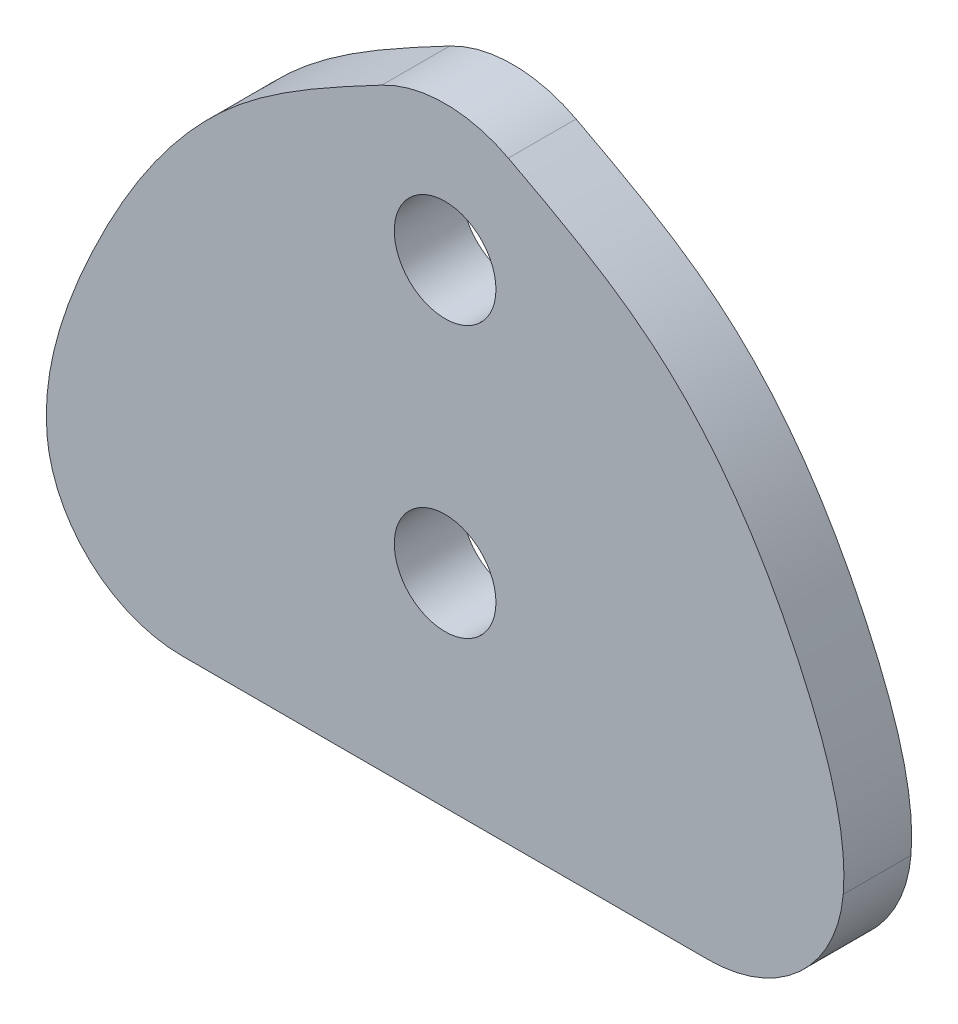
ISO-10303-21;
HEADER;
FILE_DESCRIPTION(('STEP AP214'),'2;1');
FILE_NAME('part.step','',(''),(''),'','','');
FILE_SCHEMA(('AUTOMOTIVE_DESIGN { 1 0 10303 214 1 1 1 1 }'));
ENDSEC;
DATA;
#1=APPLICATION_CONTEXT('core data for automotive mechanical design processes');
#2=APPLICATION_PROTOCOL_DEFINITION('international standard','automotive_design',2000,#1);
#3=PRODUCT_CONTEXT('',#1,'mechanical');
#4=PRODUCT('Part','Part','',(#3));
#5=PRODUCT_RELATED_PRODUCT_CATEGORY('part','',(#4));
#6=PRODUCT_DEFINITION_FORMATION('','',#4);
#7=PRODUCT_DEFINITION_CONTEXT('part definition',#1,'design');
#8=PRODUCT_DEFINITION('design','',#6,#7);
#9=PRODUCT_DEFINITION_SHAPE('','',#8);
#10=(LENGTH_UNIT() NAMED_UNIT(*) SI_UNIT(.MILLI.,.METRE.));
#11=(NAMED_UNIT(*) PLANE_ANGLE_UNIT() SI_UNIT($,.RADIAN.));
#12=(NAMED_UNIT(*) SI_UNIT($,.STERADIAN.) SOLID_ANGLE_UNIT());
#13=UNCERTAINTY_MEASURE_WITH_UNIT(LENGTH_MEASURE(1.E-05),#10,'distance_accuracy_value','');
#14=(GEOMETRIC_REPRESENTATION_CONTEXT(3) GLOBAL_UNCERTAINTY_ASSIGNED_CONTEXT((#13)) GLOBAL_UNIT_ASSIGNED_CONTEXT((#10,
#11,#12)) REPRESENTATION_CONTEXT('',''));
#15=CARTESIAN_POINT('',(0.,0.,0.));
#16=DIRECTION('',(0.,0.,1.));
#17=DIRECTION('',(1.,0.,0.));
#18=AXIS2_PLACEMENT_3D('',#15,#16,#17);
#19=CARTESIAN_POINT('',(12.326336668554,-3.175,3.175));
#20=DIRECTION('',(0.,0.,-1.));
#21=DIRECTION('',(-1.,0.,0.));
#22=AXIS2_PLACEMENT_3D('',#19,#20,#21);
#23=CYLINDRICAL_SURFACE('',#22,6.35);
#24=CARTESIAN_POINT('',(12.326336668554,-3.175,0.));
#25=DIRECTION('',(0.,0.,1.));
#26=DIRECTION('',(1.,0.,0.));
#27=AXIS2_PLACEMENT_3D('',#24,#25,#26);
#28=CIRCLE('',#27,6.35);
#29=CARTESIAN_POINT('',(18.6534616210277,-3.71350704339286,0.));
#30=VERTEX_POINT('',#29);
#31=CARTESIAN_POINT('',(12.326336668554,-9.525,0.));
#32=VERTEX_POINT('',#31);
#33=EDGE_CURVE('E126',#30,#32,#28,.F.);
#34=ORIENTED_EDGE('',*,*,#33,.F.);
#35=DIRECTION('',(0.,0.,-1.));
#36=VECTOR('',#35,1.);
#37=CARTESIAN_POINT('',(18.6534616210277,-3.71350704339286,3.175));
#38=LINE('',#37,#36);
#39=CARTESIAN_POINT('',(18.6534616210277,-3.71350704339286,3.175));
#40=VERTEX_POINT('',#39);
#41=EDGE_CURVE('E11',#40,#30,#38,.T.);
#42=ORIENTED_EDGE('',*,*,#41,.F.);
#43=CARTESIAN_POINT('',(12.326336668554,-3.175,3.175));
#44=DIRECTION('',(0.,0.,1.));
#45=DIRECTION('',(1.,0.,0.));
#46=AXIS2_PLACEMENT_3D('',#43,#44,#45);
#47=CIRCLE('',#46,6.35);
#48=CARTESIAN_POINT('',(12.326336668554,-9.525,3.175));
#49=VERTEX_POINT('',#48);
#50=EDGE_CURVE('E155',#40,#49,#47,.F.);
#51=ORIENTED_EDGE('',*,*,#50,.T.);
#52=DIRECTION('',(0.,0.,-1.));
#53=VECTOR('',#52,1.);
#54=CARTESIAN_POINT('',(12.326336668554,-9.525,3.175));
#55=LINE('',#54,#53);
#56=EDGE_CURVE('E79',#49,#32,#55,.T.);
#57=ORIENTED_EDGE('',*,*,#56,.T.);
#58=EDGE_LOOP('',(#34,#42,#51,#57));
#59=FACE_BOUND('',#58,.T.);
#60=ADVANCED_FACE('F35',(#59),#23,.T.);
#61=CARTESIAN_POINT('',(18.6534616210277,-3.71350704339286,3.175));
#62=CARTESIAN_POINT('',(18.880607200249,-1.04468686774538,3.175));
#63=CARTESIAN_POINT('',(16.4867852695352,5.87537488933572,3.175));
#64=CARTESIAN_POINT('',(11.2077517171707,13.8970934863759,3.175));
#65=CARTESIAN_POINT('',(5.42670249295262,17.0171579084702,3.175));
#66=CARTESIAN_POINT('',(2.9619234328839,18.3168950121694,3.175));
#67=B_SPLINE_CURVE_WITH_KNOTS('',3,(#61,#62,#63,#64,#65,#66),.UNSPECIFIED.,.F.,.F.,(4,1,1,4),
(0.,0.30438016254448,0.713746629811497,1.),.UNSPECIFIED.);
#68=DIRECTION('',(0.,0.,-1.));
#69=VECTOR('',#68,1.);
#70=SURFACE_OF_LINEAR_EXTRUSION('',#67,#69);
#71=CARTESIAN_POINT('',(18.6534616210277,-3.71350704339286,0.));
#72=CARTESIAN_POINT('',(18.880607200249,-1.04468686774538,0.));
#73=CARTESIAN_POINT('',(16.4867852695352,5.87537488933572,0.));
#74=CARTESIAN_POINT('',(11.2077517171707,13.8970934863759,0.));
#75=CARTESIAN_POINT('',(5.42670249295262,17.0171579084702,0.));
#76=CARTESIAN_POINT('',(2.9619234328839,18.3168950121694,0.));
#77=B_SPLINE_CURVE_WITH_KNOTS('',3,(#71,#72,#73,#74,#75,#76),.UNSPECIFIED.,.F.,.F.,(4,1,1,4),
(0.,0.30438016254448,0.713746629811497,1.),.UNSPECIFIED.);
#78=CARTESIAN_POINT('',(2.9619234328839,18.3168950121694,0.));
#79=VERTEX_POINT('',#78);
#80=EDGE_CURVE('E129',#30,#79,#77,.T.);
#81=ORIENTED_EDGE('',*,*,#80,.T.);
#82=DIRECTION('',(0.,0.,-1.));
#83=VECTOR('',#82,1.);
#84=CARTESIAN_POINT('',(2.9619234328839,18.3168950121694,3.175));
#85=LINE('',#84,#83);
#86=CARTESIAN_POINT('',(2.9619234328839,18.3168950121694,3.175));
#87=VERTEX_POINT('',#86);
#88=EDGE_CURVE('E43',#87,#79,#85,.T.);
#89=ORIENTED_EDGE('',*,*,#88,.F.);
#90=EDGE_CURVE('E169',#40,#87,#67,.T.);
#91=ORIENTED_EDGE('',*,*,#90,.F.);
#92=ORIENTED_EDGE('',*,*,#41,.T.);
#93=EDGE_LOOP('',(#81,#89,#91,#92));
#94=FACE_BOUND('',#93,.T.);
#95=ADVANCED_FACE('F178',(#94),#70,.F.);
#96=CARTESIAN_POINT('',(0.,12.7,3.175));
#97=DIRECTION('',(0.,0.,-1.));
#98=DIRECTION('',(-1.,0.,0.));
#99=AXIS2_PLACEMENT_3D('',#96,#97,#98);
#100=CYLINDRICAL_SURFACE('',#99,6.35);
#101=CARTESIAN_POINT('',(0.,12.7,0.));
#102=DIRECTION('',(0.,0.,1.));
#103=DIRECTION('',(1.,0.,0.));
#104=AXIS2_PLACEMENT_3D('',#101,#102,#103);
#105=CIRCLE('',#104,6.35);
#106=CARTESIAN_POINT('',(-2.9619234328839,18.3168950121694,0.));
#107=VERTEX_POINT('',#106);
#108=EDGE_CURVE('E133',#79,#107,#105,.T.);
#109=ORIENTED_EDGE('',*,*,#108,.T.);
#110=DIRECTION('',(0.,0.,-1.));
#111=VECTOR('',#110,1.);
#112=CARTESIAN_POINT('',(-2.9619234328839,18.3168950121694,3.175));
#113=LINE('',#112,#111);
#114=CARTESIAN_POINT('',(-2.9619234328839,18.3168950121694,3.175));
#115=VERTEX_POINT('',#114);
#116=EDGE_CURVE('E103',#115,#107,#113,.T.);
#117=ORIENTED_EDGE('',*,*,#116,.F.);
#118=CARTESIAN_POINT('',(0.,12.7,3.175));
#119=DIRECTION('',(0.,0.,1.));
#120=DIRECTION('',(1.,0.,0.));
#121=AXIS2_PLACEMENT_3D('',#118,#119,#120);
#122=CIRCLE('',#121,6.35);
#123=EDGE_CURVE('E109',#87,#115,#122,.T.);
#124=ORIENTED_EDGE('',*,*,#123,.F.);
#125=ORIENTED_EDGE('',*,*,#88,.T.);
#126=EDGE_LOOP('',(#109,#117,#124,#125));
#127=FACE_BOUND('',#126,.T.);
#128=ADVANCED_FACE('F162',(#127),#100,.T.);
#129=CARTESIAN_POINT('',(-18.6534616210277,-3.71350704339286,3.175));
#130=CARTESIAN_POINT('',(-18.880607200249,-1.04468686774538,3.175));
#131=CARTESIAN_POINT('',(-16.4867852695352,5.87537488933572,3.175));
#132=CARTESIAN_POINT('',(-11.2077517171707,13.8970934863759,3.175));
#133=CARTESIAN_POINT('',(-5.42670249295262,17.0171579084702,3.175));
#134=CARTESIAN_POINT('',(-2.9619234328839,18.3168950121694,3.175));
#135=B_SPLINE_CURVE_WITH_KNOTS('',3,(#129,#130,#131,#132,#133,#134),.UNSPECIFIED.,.F.,.F.,(4,1,
1,4),(0.,0.30438016254448,0.713746629811497,1.),.UNSPECIFIED.);
#136=DIRECTION('',(0.,0.,-1.));
#137=VECTOR('',#136,1.);
#138=SURFACE_OF_LINEAR_EXTRUSION('',#135,#137);
#139=CARTESIAN_POINT('',(-18.6534616210277,-3.71350704339286,0.));
#140=CARTESIAN_POINT('',(-18.880607200249,-1.04468686774538,0.));
#141=CARTESIAN_POINT('',(-16.4867852695352,5.87537488933572,0.));
#142=CARTESIAN_POINT('',(-11.2077517171707,13.8970934863759,0.));
#143=CARTESIAN_POINT('',(-5.42670249295262,17.0171579084702,0.));
#144=CARTESIAN_POINT('',(-2.9619234328839,18.3168950121694,0.));
#145=B_SPLINE_CURVE_WITH_KNOTS('',3,(#139,#140,#141,#142,#143,#144),.UNSPECIFIED.,.F.,.F.,(4,1,
1,4),(0.,0.30438016254448,0.713746629811497,1.),.UNSPECIFIED.);
#146=CARTESIAN_POINT('',(-18.6534616210277,-3.71350704339286,0.));
#147=VERTEX_POINT('',#146);
#148=EDGE_CURVE('E98',#147,#107,#145,.T.);
#149=ORIENTED_EDGE('',*,*,#148,.F.);
#150=DIRECTION('',(0.,0.,-1.));
#151=VECTOR('',#150,1.);
#152=CARTESIAN_POINT('',(-18.6534616210277,-3.71350704339286,3.175));
#153=LINE('',#152,#151);
#154=CARTESIAN_POINT('',(-18.6534616210277,-3.71350704339286,3.175));
#155=VERTEX_POINT('',#154);
#156=EDGE_CURVE('E93',#155,#147,#153,.T.);
#157=ORIENTED_EDGE('',*,*,#156,.F.);
#158=EDGE_CURVE('E96',#155,#115,#135,.T.);
#159=ORIENTED_EDGE('',*,*,#158,.T.);
#160=ORIENTED_EDGE('',*,*,#116,.T.);
#161=EDGE_LOOP('',(#149,#157,#159,#160));
#162=FACE_BOUND('',#161,.T.);
#163=ADVANCED_FACE('F95',(#162),#138,.T.);
#164=CARTESIAN_POINT('',(-12.326336668554,-3.175,3.175));
#165=DIRECTION('',(0.,0.,-1.));
#166=DIRECTION('',(-1.,0.,0.));
#167=AXIS2_PLACEMENT_3D('',#164,#165,#166);
#168=CYLINDRICAL_SURFACE('',#167,6.35);
#169=CARTESIAN_POINT('',(-12.326336668554,-3.175,0.));
#170=DIRECTION('',(0.,0.,1.));
#171=DIRECTION('',(1.,0.,0.));
#172=AXIS2_PLACEMENT_3D('',#169,#170,#171);
#173=CIRCLE('',#172,6.35);
#174=CARTESIAN_POINT('',(-12.326336668554,-9.525,0.));
#175=VERTEX_POINT('',#174);
#176=EDGE_CURVE('E142',#175,#147,#173,.F.);
#177=ORIENTED_EDGE('',*,*,#176,.F.);
#178=DIRECTION('',(0.,0.,-1.));
#179=VECTOR('',#178,1.);
#180=CARTESIAN_POINT('',(-12.326336668554,-9.525,3.175));
#181=LINE('',#180,#179);
#182=CARTESIAN_POINT('',(-12.326336668554,-9.525,3.175));
#183=VERTEX_POINT('',#182);
#184=EDGE_CURVE('E72',#183,#175,#181,.T.);
#185=ORIENTED_EDGE('',*,*,#184,.F.);
#186=CARTESIAN_POINT('',(-12.326336668554,-3.175,3.175));
#187=DIRECTION('',(0.,0.,1.));
#188=DIRECTION('',(1.,0.,0.));
#189=AXIS2_PLACEMENT_3D('',#186,#187,#188);
#190=CIRCLE('',#189,6.35);
#191=EDGE_CURVE('E107',#183,#155,#190,.F.);
#192=ORIENTED_EDGE('',*,*,#191,.T.);
#193=ORIENTED_EDGE('',*,*,#156,.T.);
#194=EDGE_LOOP('',(#177,#185,#192,#193));
#195=FACE_BOUND('',#194,.T.);
#196=ADVANCED_FACE('F112',(#195),#168,.T.);
#197=CARTESIAN_POINT('',(0.,12.7,3.175));
#198=DIRECTION('',(0.,0.,-1.));
#199=DIRECTION('',(-1.,0.,0.));
#200=AXIS2_PLACEMENT_3D('',#197,#198,#199);
#201=CYLINDRICAL_SURFACE('',#200,2.38125);
#202=CARTESIAN_POINT('',(0.,12.7,3.175));
#203=DIRECTION('',(0.,0.,1.));
#204=DIRECTION('',(1.,0.,0.));
#205=AXIS2_PLACEMENT_3D('',#202,#203,#204);
#206=CIRCLE('',#205,2.38125);
#207=CARTESIAN_POINT('',(2.38125,12.7,3.175));
#208=VERTEX_POINT('',#207);
#209=EDGE_CURVE('E114',#208,#208,#206,.T.);
#210=ORIENTED_EDGE('',*,*,#209,.T.);
#211=EDGE_LOOP('',(#210));
#212=FACE_BOUND('',#211,.T.);
#213=CARTESIAN_POINT('',(0.,12.7,0.));
#214=DIRECTION('',(0.,0.,1.));
#215=DIRECTION('',(1.,0.,0.));
#216=AXIS2_PLACEMENT_3D('',#213,#214,#215);
#217=CIRCLE('',#216,2.38125);
#218=CARTESIAN_POINT('',(2.38125,12.7,0.));
#219=VERTEX_POINT('',#218);
#220=EDGE_CURVE('E149',#219,#219,#217,.T.);
#221=ORIENTED_EDGE('',*,*,#220,.F.);
#222=EDGE_LOOP('',(#221));
#223=FACE_BOUND('',#222,.T.);
#224=ADVANCED_FACE('F187',(#212,#223),#201,.F.);
#225=CARTESIAN_POINT('',(0.,-9.525,3.175));
#226=DIRECTION('',(0.,1.,0.));
#227=DIRECTION('',(0.,0.,1.));
#228=AXIS2_PLACEMENT_3D('',#225,#226,#227);
#229=PLANE('',#228);
#230=DIRECTION('',(1.,0.,0.));
#231=VECTOR('',#230,1.);
#232=CARTESIAN_POINT('',(0.,-9.525,0.));
#233=LINE('',#232,#231);
#234=EDGE_CURVE('E147',#175,#32,#233,.T.);
#235=ORIENTED_EDGE('',*,*,#234,.T.);
#236=ORIENTED_EDGE('',*,*,#56,.F.);
#237=DIRECTION('',(1.,0.,0.));
#238=VECTOR('',#237,1.);
#239=CARTESIAN_POINT('',(0.,-9.525,3.175));
#240=LINE('',#239,#238);
#241=EDGE_CURVE('E51',#183,#49,#240,.T.);
#242=ORIENTED_EDGE('',*,*,#241,.F.);
#243=ORIENTED_EDGE('',*,*,#184,.T.);
#244=EDGE_LOOP('',(#235,#236,#242,#243));
#245=FACE_BOUND('',#244,.T.);
#246=ADVANCED_FACE('F168',(#245),#229,.F.);
#247=CARTESIAN_POINT('',(0.,0.,3.175));
#248=DIRECTION('',(0.,0.,-1.));
#249=DIRECTION('',(-1.,0.,0.));
#250=AXIS2_PLACEMENT_3D('',#247,#248,#249);
#251=CYLINDRICAL_SURFACE('',#250,2.38125);
#252=CARTESIAN_POINT('',(0.,0.,3.175));
#253=DIRECTION('',(0.,0.,1.));
#254=DIRECTION('',(1.,0.,0.));
#255=AXIS2_PLACEMENT_3D('',#252,#253,#254);
#256=CIRCLE('',#255,2.38125);
#257=CARTESIAN_POINT('',(2.38125,0.,3.175));
#258=VERTEX_POINT('',#257);
#259=EDGE_CURVE('E123',#258,#258,#256,.T.);
#260=ORIENTED_EDGE('',*,*,#259,.T.);
#261=EDGE_LOOP('',(#260));
#262=FACE_BOUND('',#261,.T.);
#263=CARTESIAN_POINT('',(0.,0.,0.));
#264=DIRECTION('',(0.,0.,1.));
#265=DIRECTION('',(1.,0.,0.));
#266=AXIS2_PLACEMENT_3D('',#263,#264,#265);
#267=CIRCLE('',#266,2.38125);
#268=CARTESIAN_POINT('',(2.38125,0.,0.));
#269=VERTEX_POINT('',#268);
#270=EDGE_CURVE('E152',#269,#269,#267,.T.);
#271=ORIENTED_EDGE('',*,*,#270,.F.);
#272=EDGE_LOOP('',(#271));
#273=FACE_BOUND('',#272,.T.);
#274=ADVANCED_FACE('F190',(#262,#273),#251,.F.);
#275=CARTESIAN_POINT('',(0.,0.,3.175));
#276=DIRECTION('',(0.,0.,1.));
#277=DIRECTION('',(1.,0.,0.));
#278=AXIS2_PLACEMENT_3D('',#275,#276,#277);
#279=PLANE('',#278);
#280=ORIENTED_EDGE('',*,*,#50,.F.);
#281=ORIENTED_EDGE('',*,*,#90,.T.);
#282=ORIENTED_EDGE('',*,*,#123,.T.);
#283=ORIENTED_EDGE('',*,*,#158,.F.);
#284=ORIENTED_EDGE('',*,*,#191,.F.);
#285=ORIENTED_EDGE('',*,*,#241,.T.);
#286=EDGE_LOOP('',(#280,#281,#282,#283,#284,#285));
#287=FACE_BOUND('',#286,.T.);
#288=ORIENTED_EDGE('',*,*,#209,.F.);
#289=EDGE_LOOP('',(#288));
#290=FACE_BOUND('',#289,.T.);
#291=ORIENTED_EDGE('',*,*,#259,.F.);
#292=EDGE_LOOP('',(#291));
#293=FACE_BOUND('',#292,.T.);
#294=ADVANCED_FACE('F105',(#287,#290,#293),#279,.T.);
#295=CARTESIAN_POINT('',(0.,0.,0.));
#296=DIRECTION('',(0.,0.,1.));
#297=DIRECTION('',(1.,0.,0.));
#298=AXIS2_PLACEMENT_3D('',#295,#296,#297);
#299=PLANE('',#298);
#300=ORIENTED_EDGE('',*,*,#33,.T.);
#301=ORIENTED_EDGE('',*,*,#234,.F.);
#302=ORIENTED_EDGE('',*,*,#176,.T.);
#303=ORIENTED_EDGE('',*,*,#148,.T.);
#304=ORIENTED_EDGE('',*,*,#108,.F.);
#305=ORIENTED_EDGE('',*,*,#80,.F.);
#306=EDGE_LOOP('',(#300,#301,#302,#303,#304,#305));
#307=FACE_BOUND('',#306,.T.);
#308=ORIENTED_EDGE('',*,*,#220,.T.);
#309=EDGE_LOOP('',(#308));
#310=FACE_BOUND('',#309,.T.);
#311=ORIENTED_EDGE('',*,*,#270,.T.);
#312=EDGE_LOOP('',(#311));
#313=FACE_BOUND('',#312,.T.);
#314=ADVANCED_FACE('F166',(#307,#310,#313),#299,.F.);
#315=CLOSED_SHELL('',(#60,#95,#128,#163,#196,#224,#246,#274,#294,#314));
#316=MANIFOLD_SOLID_BREP('B2',#315);
#317=ADVANCED_BREP_SHAPE_REPRESENTATION('',(#18,#316),#14);
#318=SHAPE_DEFINITION_REPRESENTATION(#9,#317);
ENDSEC;
END-ISO-10303-21;
